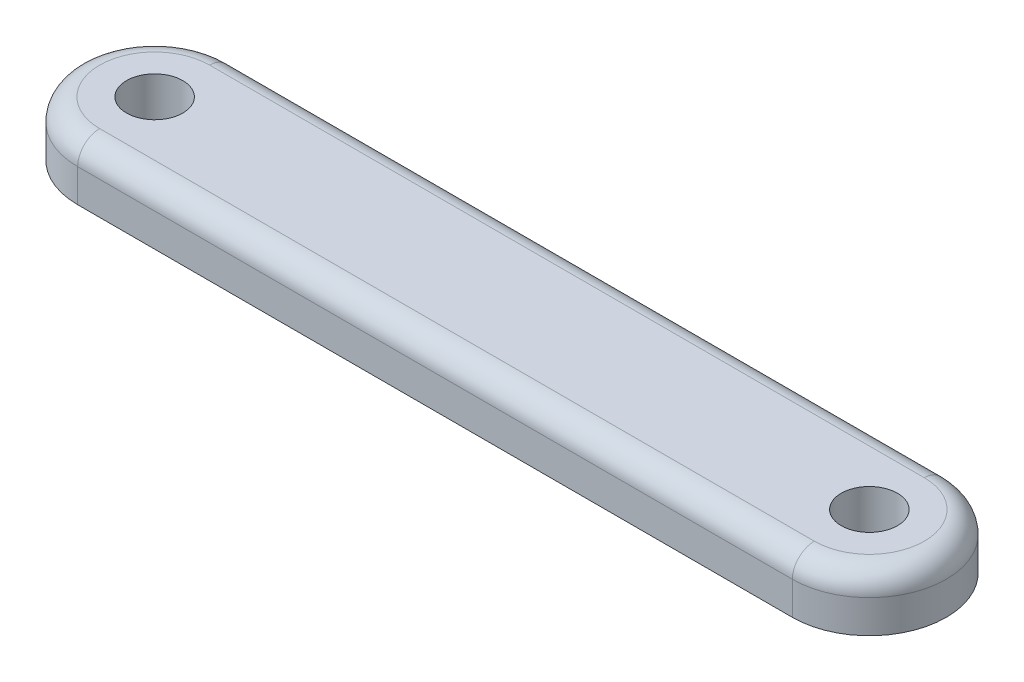
ISO-10303-21;
HEADER;
FILE_DESCRIPTION(('STEP AP214'),'2;1');
FILE_NAME('part.step','',(''),(''),'','','');
FILE_SCHEMA(('AUTOMOTIVE_DESIGN { 1 0 10303 214 1 1 1 1 }'));
ENDSEC;
DATA;
#1=APPLICATION_CONTEXT('core data for automotive mechanical design processes');
#2=APPLICATION_PROTOCOL_DEFINITION('international standard','automotive_design',2000,#1);
#3=PRODUCT_CONTEXT('',#1,'mechanical');
#4=PRODUCT('Part','Part','',(#3));
#5=PRODUCT_RELATED_PRODUCT_CATEGORY('part','',(#4));
#6=PRODUCT_DEFINITION_FORMATION('','',#4);
#7=PRODUCT_DEFINITION_CONTEXT('part definition',#1,'design');
#8=PRODUCT_DEFINITION('design','',#6,#7);
#9=PRODUCT_DEFINITION_SHAPE('','',#8);
#10=(LENGTH_UNIT() NAMED_UNIT(*) SI_UNIT(.MILLI.,.METRE.));
#11=(NAMED_UNIT(*) PLANE_ANGLE_UNIT() SI_UNIT($,.RADIAN.));
#12=(NAMED_UNIT(*) SI_UNIT($,.STERADIAN.) SOLID_ANGLE_UNIT());
#13=UNCERTAINTY_MEASURE_WITH_UNIT(LENGTH_MEASURE(1.E-05),#10,'distance_accuracy_value','');
#14=(GEOMETRIC_REPRESENTATION_CONTEXT(3) GLOBAL_UNCERTAINTY_ASSIGNED_CONTEXT((#13)) GLOBAL_UNIT_ASSIGNED_CONTEXT((#10,
#11,#12)) REPRESENTATION_CONTEXT('',''));
#15=CARTESIAN_POINT('',(0.,0.,0.));
#16=DIRECTION('',(0.,0.,1.));
#17=DIRECTION('',(1.,0.,0.));
#18=AXIS2_PLACEMENT_3D('',#15,#16,#17);
#19=CARTESIAN_POINT('',(33.02,2.54,0.));
#20=DIRECTION('',(0.,-1.,0.));
#21=DIRECTION('',(0.,0.,-1.));
#22=AXIS2_PLACEMENT_3D('',#19,#20,#21);
#23=CYLINDRICAL_SURFACE('',#22,3.556);
#24=DIRECTION('',(0.,-1.,0.));
#25=VECTOR('',#24,1.);
#26=CARTESIAN_POINT('',(33.02,2.54,-3.556));
#27=LINE('',#26,#25);
#28=CARTESIAN_POINT('',(33.02,1.524,-3.556));
#29=VERTEX_POINT('',#28);
#30=CARTESIAN_POINT('',(33.02,0.,-3.556));
#31=VERTEX_POINT('',#30);
#32=EDGE_CURVE('E99',#29,#31,#27,.T.);
#33=ORIENTED_EDGE('',*,*,#32,.F.);
#34=CARTESIAN_POINT('',(33.02,1.524,0.));
#35=DIRECTION('',(0.,1.,0.));
#36=DIRECTION('',(0.,0.,1.));
#37=AXIS2_PLACEMENT_3D('',#34,#35,#36);
#38=CIRCLE('',#37,3.556);
#39=CARTESIAN_POINT('',(33.02,1.524,3.556));
#40=VERTEX_POINT('',#39);
#41=EDGE_CURVE('E57',#29,#40,#38,.F.);
#42=ORIENTED_EDGE('',*,*,#41,.T.);
#43=DIRECTION('',(0.,-1.,0.));
#44=VECTOR('',#43,1.);
#45=CARTESIAN_POINT('',(33.02,2.54,3.556));
#46=LINE('',#45,#44);
#47=CARTESIAN_POINT('',(33.02,0.,3.556));
#48=VERTEX_POINT('',#47);
#49=EDGE_CURVE('E110',#40,#48,#46,.T.);
#50=ORIENTED_EDGE('',*,*,#49,.T.);
#51=CARTESIAN_POINT('',(33.02,0.,0.));
#52=DIRECTION('',(0.,1.,0.));
#53=DIRECTION('',(0.,0.,1.));
#54=AXIS2_PLACEMENT_3D('',#51,#52,#53);
#55=CIRCLE('',#54,3.556);
#56=EDGE_CURVE('E109',#31,#48,#55,.F.);
#57=ORIENTED_EDGE('',*,*,#56,.F.);
#58=EDGE_LOOP('',(#33,#42,#50,#57));
#59=FACE_BOUND('',#58,.T.);
#60=ADVANCED_FACE('F47',(#59),#23,.T.);
#61=CARTESIAN_POINT('',(0.,2.54,-3.556));
#62=DIRECTION('',(0.,0.,-1.));
#63=DIRECTION('',(-1.,0.,0.));
#64=AXIS2_PLACEMENT_3D('',#61,#62,#63);
#65=PLANE('',#64);
#66=DIRECTION('',(0.,-1.,0.));
#67=VECTOR('',#66,1.);
#68=CARTESIAN_POINT('',(0.,2.54,-3.556));
#69=LINE('',#68,#67);
#70=CARTESIAN_POINT('',(0.,1.524,-3.556));
#71=VERTEX_POINT('',#70);
#72=CARTESIAN_POINT('',(0.,0.,-3.556));
#73=VERTEX_POINT('',#72);
#74=EDGE_CURVE('E106',#71,#73,#69,.T.);
#75=ORIENTED_EDGE('',*,*,#74,.F.);
#76=DIRECTION('',(1.,0.,0.));
#77=VECTOR('',#76,1.);
#78=CARTESIAN_POINT('',(0.,1.524,-3.556));
#79=LINE('',#78,#77);
#80=EDGE_CURVE('E11',#71,#29,#79,.T.);
#81=ORIENTED_EDGE('',*,*,#80,.T.);
#82=ORIENTED_EDGE('',*,*,#32,.T.);
#83=DIRECTION('',(1.,0.,0.));
#84=VECTOR('',#83,1.);
#85=CARTESIAN_POINT('',(0.,0.,-3.556));
#86=LINE('',#85,#84);
#87=EDGE_CURVE('E103',#73,#31,#86,.T.);
#88=ORIENTED_EDGE('',*,*,#87,.F.);
#89=EDGE_LOOP('',(#75,#81,#82,#88));
#90=FACE_BOUND('',#89,.T.);
#91=ADVANCED_FACE('F101',(#90),#65,.T.);
#92=CARTESIAN_POINT('',(0.,2.54,0.));
#93=DIRECTION('',(0.,-1.,0.));
#94=DIRECTION('',(0.,0.,-1.));
#95=AXIS2_PLACEMENT_3D('',#92,#93,#94);
#96=CYLINDRICAL_SURFACE('',#95,3.556);
#97=DIRECTION('',(0.,-1.,0.));
#98=VECTOR('',#97,1.);
#99=CARTESIAN_POINT('',(0.,2.54,3.556));
#100=LINE('',#99,#98);
#101=CARTESIAN_POINT('',(0.,1.524,3.556));
#102=VERTEX_POINT('',#101);
#103=CARTESIAN_POINT('',(0.,0.,3.556));
#104=VERTEX_POINT('',#103);
#105=EDGE_CURVE('E138',#102,#104,#100,.T.);
#106=ORIENTED_EDGE('',*,*,#105,.F.);
#107=CARTESIAN_POINT('',(0.,1.524,0.));
#108=DIRECTION('',(0.,1.,0.));
#109=DIRECTION('',(0.,0.,1.));
#110=AXIS2_PLACEMENT_3D('',#107,#108,#109);
#111=CIRCLE('',#110,3.556);
#112=EDGE_CURVE('E156',#102,#71,#111,.F.);
#113=ORIENTED_EDGE('',*,*,#112,.T.);
#114=ORIENTED_EDGE('',*,*,#74,.T.);
#115=CARTESIAN_POINT('',(0.,0.,0.));
#116=DIRECTION('',(0.,1.,0.));
#117=DIRECTION('',(0.,0.,1.));
#118=AXIS2_PLACEMENT_3D('',#115,#116,#117);
#119=CIRCLE('',#118,3.556);
#120=EDGE_CURVE('E121',#73,#104,#119,.T.);
#121=ORIENTED_EDGE('',*,*,#120,.T.);
#122=EDGE_LOOP('',(#106,#113,#114,#121));
#123=FACE_BOUND('',#122,.T.);
#124=ADVANCED_FACE('F221',(#123),#96,.T.);
#125=CARTESIAN_POINT('',(0.,2.54,3.556));
#126=DIRECTION('',(0.,0.,-1.));
#127=DIRECTION('',(-1.,0.,0.));
#128=AXIS2_PLACEMENT_3D('',#125,#126,#127);
#129=PLANE('',#128);
#130=ORIENTED_EDGE('',*,*,#49,.F.);
#131=DIRECTION('',(1.,0.,0.));
#132=VECTOR('',#131,1.);
#133=CARTESIAN_POINT('',(0.,1.524,3.556));
#134=LINE('',#133,#132);
#135=EDGE_CURVE('E160',#40,#102,#134,.F.);
#136=ORIENTED_EDGE('',*,*,#135,.T.);
#137=ORIENTED_EDGE('',*,*,#105,.T.);
#138=DIRECTION('',(1.,0.,0.));
#139=VECTOR('',#138,1.);
#140=CARTESIAN_POINT('',(0.,0.,3.556));
#141=LINE('',#140,#139);
#142=EDGE_CURVE('E125',#104,#48,#141,.T.);
#143=ORIENTED_EDGE('',*,*,#142,.T.);
#144=EDGE_LOOP('',(#130,#136,#137,#143));
#145=FACE_BOUND('',#144,.T.);
#146=ADVANCED_FACE('F227',(#145),#129,.F.);
#147=CARTESIAN_POINT('',(0.,2.54,0.));
#148=DIRECTION('',(0.,-1.,0.));
#149=DIRECTION('',(0.,0.,-1.));
#150=AXIS2_PLACEMENT_3D('',#147,#148,#149);
#151=CYLINDRICAL_SURFACE('',#150,1.3);
#152=CARTESIAN_POINT('',(0.,2.54,0.));
#153=DIRECTION('',(0.,1.,0.));
#154=DIRECTION('',(0.,0.,1.));
#155=AXIS2_PLACEMENT_3D('',#152,#153,#154);
#156=CIRCLE('',#155,1.3);
#157=CARTESIAN_POINT('',(0.,2.54,1.3));
#158=VERTEX_POINT('',#157);
#159=EDGE_CURVE('E135',#158,#158,#156,.T.);
#160=ORIENTED_EDGE('',*,*,#159,.T.);
#161=EDGE_LOOP('',(#160));
#162=FACE_BOUND('',#161,.T.);
#163=CARTESIAN_POINT('',(0.,0.,0.));
#164=DIRECTION('',(0.,1.,0.));
#165=DIRECTION('',(0.,0.,1.));
#166=AXIS2_PLACEMENT_3D('',#163,#164,#165);
#167=CIRCLE('',#166,1.3);
#168=CARTESIAN_POINT('',(0.,0.,1.3));
#169=VERTEX_POINT('',#168);
#170=EDGE_CURVE('E115',#169,#169,#167,.T.);
#171=ORIENTED_EDGE('',*,*,#170,.F.);
#172=EDGE_LOOP('',(#171));
#173=FACE_BOUND('',#172,.T.);
#174=ADVANCED_FACE('F194',(#162,#173),#151,.F.);
#175=CARTESIAN_POINT('',(33.02,2.54,0.));
#176=DIRECTION('',(0.,-1.,0.));
#177=DIRECTION('',(0.,0.,-1.));
#178=AXIS2_PLACEMENT_3D('',#175,#176,#177);
#179=CYLINDRICAL_SURFACE('',#178,1.3);
#180=CARTESIAN_POINT('',(33.02,2.54,0.));
#181=DIRECTION('',(0.,1.,0.));
#182=DIRECTION('',(0.,0.,1.));
#183=AXIS2_PLACEMENT_3D('',#180,#181,#182);
#184=CIRCLE('',#183,1.3);
#185=CARTESIAN_POINT('',(33.02,2.54,1.3));
#186=VERTEX_POINT('',#185);
#187=EDGE_CURVE('E139',#186,#186,#184,.T.);
#188=ORIENTED_EDGE('',*,*,#187,.T.);
#189=EDGE_LOOP('',(#188));
#190=FACE_BOUND('',#189,.T.);
#191=CARTESIAN_POINT('',(33.02,0.,0.));
#192=DIRECTION('',(0.,1.,0.));
#193=DIRECTION('',(0.,0.,1.));
#194=AXIS2_PLACEMENT_3D('',#191,#192,#193);
#195=CIRCLE('',#194,1.3);
#196=CARTESIAN_POINT('',(33.02,0.,1.3));
#197=VERTEX_POINT('',#196);
#198=EDGE_CURVE('E131',#197,#197,#195,.T.);
#199=ORIENTED_EDGE('',*,*,#198,.F.);
#200=EDGE_LOOP('',(#199));
#201=FACE_BOUND('',#200,.T.);
#202=ADVANCED_FACE('F200',(#190,#201),#179,.F.);
#203=CARTESIAN_POINT('',(0.,2.54,0.));
#204=DIRECTION('',(0.,1.,0.));
#205=DIRECTION('',(0.,0.,1.));
#206=AXIS2_PLACEMENT_3D('',#203,#204,#205);
#207=PLANE('',#206);
#208=DIRECTION('',(1.,0.,0.));
#209=VECTOR('',#208,1.);
#210=CARTESIAN_POINT('',(0.,2.54,-2.54));
#211=LINE('',#210,#209);
#212=CARTESIAN_POINT('',(33.02,2.54,-2.54));
#213=VERTEX_POINT('',#212);
#214=CARTESIAN_POINT('',(0.,2.54,-2.54));
#215=VERTEX_POINT('',#214);
#216=EDGE_CURVE('E105',#213,#215,#211,.F.);
#217=ORIENTED_EDGE('',*,*,#216,.T.);
#218=CARTESIAN_POINT('',(0.,2.54,0.));
#219=DIRECTION('',(0.,1.,0.));
#220=DIRECTION('',(0.,0.,1.));
#221=AXIS2_PLACEMENT_3D('',#218,#219,#220);
#222=CIRCLE('',#221,2.54);
#223=CARTESIAN_POINT('',(0.,2.54,2.54));
#224=VERTEX_POINT('',#223);
#225=EDGE_CURVE('E152',#215,#224,#222,.T.);
#226=ORIENTED_EDGE('',*,*,#225,.T.);
#227=DIRECTION('',(1.,0.,0.));
#228=VECTOR('',#227,1.);
#229=CARTESIAN_POINT('',(33.02,2.54,2.54));
#230=LINE('',#229,#228);
#231=CARTESIAN_POINT('',(33.02,2.54,2.54));
#232=VERTEX_POINT('',#231);
#233=EDGE_CURVE('E149',#224,#232,#230,.T.);
#234=ORIENTED_EDGE('',*,*,#233,.T.);
#235=CARTESIAN_POINT('',(33.02,2.54,0.));
#236=DIRECTION('',(0.,1.,0.));
#237=DIRECTION('',(0.,0.,1.));
#238=AXIS2_PLACEMENT_3D('',#235,#236,#237);
#239=CIRCLE('',#238,2.54);
#240=EDGE_CURVE('E146',#232,#213,#239,.T.);
#241=ORIENTED_EDGE('',*,*,#240,.T.);
#242=EDGE_LOOP('',(#217,#226,#234,#241));
#243=FACE_BOUND('',#242,.T.);
#244=ORIENTED_EDGE('',*,*,#159,.F.);
#245=EDGE_LOOP('',(#244));
#246=FACE_BOUND('',#245,.T.);
#247=ORIENTED_EDGE('',*,*,#187,.F.);
#248=EDGE_LOOP('',(#247));
#249=FACE_BOUND('',#248,.T.);
#250=ADVANCED_FACE('F197',(#243,#246,#249),#207,.T.);
#251=CARTESIAN_POINT('',(0.,0.,0.));
#252=DIRECTION('',(0.,1.,0.));
#253=DIRECTION('',(0.,0.,1.));
#254=AXIS2_PLACEMENT_3D('',#251,#252,#253);
#255=PLANE('',#254);
#256=ORIENTED_EDGE('',*,*,#170,.T.);
#257=EDGE_LOOP('',(#256));
#258=FACE_BOUND('',#257,.T.);
#259=ORIENTED_EDGE('',*,*,#56,.T.);
#260=ORIENTED_EDGE('',*,*,#142,.F.);
#261=ORIENTED_EDGE('',*,*,#120,.F.);
#262=ORIENTED_EDGE('',*,*,#87,.T.);
#263=EDGE_LOOP('',(#259,#260,#261,#262));
#264=FACE_BOUND('',#263,.T.);
#265=ORIENTED_EDGE('',*,*,#198,.T.);
#266=EDGE_LOOP('',(#265));
#267=FACE_BOUND('',#266,.T.);
#268=ADVANCED_FACE('F118',(#258,#264,#267),#255,.F.);
#269=CARTESIAN_POINT('',(33.02,1.524,0.));
#270=DIRECTION('',(0.,1.,0.));
#271=DIRECTION('',(0.,0.,1.));
#272=AXIS2_PLACEMENT_3D('',#269,#270,#271);
#273=TOROIDAL_SURFACE('',#272,2.54,1.016);
#274=CARTESIAN_POINT('',(33.02,1.524,2.54));
#275=DIRECTION('',(-1.,0.,0.));
#276=DIRECTION('',(0.,0.,1.));
#277=AXIS2_PLACEMENT_3D('',#274,#275,#276);
#278=CIRCLE('',#277,1.016);
#279=EDGE_CURVE('E170',#40,#232,#278,.T.);
#280=ORIENTED_EDGE('',*,*,#279,.F.);
#281=ORIENTED_EDGE('',*,*,#41,.F.);
#282=CARTESIAN_POINT('',(33.02,1.524,-2.54));
#283=DIRECTION('',(-1.,0.,0.));
#284=DIRECTION('',(0.,0.,1.));
#285=AXIS2_PLACEMENT_3D('',#282,#283,#284);
#286=CIRCLE('',#285,1.016);
#287=EDGE_CURVE('E51',#213,#29,#286,.T.);
#288=ORIENTED_EDGE('',*,*,#287,.F.);
#289=ORIENTED_EDGE('',*,*,#240,.F.);
#290=EDGE_LOOP('',(#280,#281,#288,#289));
#291=FACE_BOUND('',#290,.T.);
#292=ADVANCED_FACE('F49',(#291),#273,.T.);
#293=CARTESIAN_POINT('',(0.,1.524,-2.54));
#294=DIRECTION('',(1.,0.,0.));
#295=DIRECTION('',(0.,0.,-1.));
#296=AXIS2_PLACEMENT_3D('',#293,#294,#295);
#297=CYLINDRICAL_SURFACE('',#296,1.016);
#298=ORIENTED_EDGE('',*,*,#287,.T.);
#299=ORIENTED_EDGE('',*,*,#80,.F.);
#300=CARTESIAN_POINT('',(0.,1.524,-2.54));
#301=DIRECTION('',(-1.,0.,0.));
#302=DIRECTION('',(0.,0.,1.));
#303=AXIS2_PLACEMENT_3D('',#300,#301,#302);
#304=CIRCLE('',#303,1.016);
#305=EDGE_CURVE('E168',#215,#71,#304,.T.);
#306=ORIENTED_EDGE('',*,*,#305,.F.);
#307=ORIENTED_EDGE('',*,*,#216,.F.);
#308=EDGE_LOOP('',(#298,#299,#306,#307));
#309=FACE_BOUND('',#308,.T.);
#310=ADVANCED_FACE('F215',(#309),#297,.T.);
#311=CARTESIAN_POINT('',(0.,1.524,2.54));
#312=DIRECTION('',(-1.,0.,0.));
#313=DIRECTION('',(0.,0.,1.));
#314=AXIS2_PLACEMENT_3D('',#311,#312,#313);
#315=CYLINDRICAL_SURFACE('',#314,1.016);
#316=ORIENTED_EDGE('',*,*,#279,.T.);
#317=ORIENTED_EDGE('',*,*,#233,.F.);
#318=CARTESIAN_POINT('',(0.,1.524,2.54));
#319=DIRECTION('',(-1.,0.,0.));
#320=DIRECTION('',(0.,0.,1.));
#321=AXIS2_PLACEMENT_3D('',#318,#319,#320);
#322=CIRCLE('',#321,1.016);
#323=EDGE_CURVE('E165',#102,#224,#322,.T.);
#324=ORIENTED_EDGE('',*,*,#323,.F.);
#325=ORIENTED_EDGE('',*,*,#135,.F.);
#326=EDGE_LOOP('',(#316,#317,#324,#325));
#327=FACE_BOUND('',#326,.T.);
#328=ADVANCED_FACE('F231',(#327),#315,.T.);
#329=CARTESIAN_POINT('',(0.,1.524,0.));
#330=DIRECTION('',(0.,1.,0.));
#331=DIRECTION('',(0.,0.,1.));
#332=AXIS2_PLACEMENT_3D('',#329,#330,#331);
#333=TOROIDAL_SURFACE('',#332,2.54,1.016);
#334=ORIENTED_EDGE('',*,*,#305,.T.);
#335=ORIENTED_EDGE('',*,*,#112,.F.);
#336=ORIENTED_EDGE('',*,*,#323,.T.);
#337=ORIENTED_EDGE('',*,*,#225,.F.);
#338=EDGE_LOOP('',(#334,#335,#336,#337));
#339=FACE_BOUND('',#338,.T.);
#340=ADVANCED_FACE('F228',(#339),#333,.T.);
#341=CLOSED_SHELL('',(#60,#91,#124,#146,#174,#202,#250,#268,#292,#310,#328,#340));
#342=MANIFOLD_SOLID_BREP('B2',#341);
#343=ADVANCED_BREP_SHAPE_REPRESENTATION('',(#18,#342),#14);
#344=SHAPE_DEFINITION_REPRESENTATION(#9,#343);
ENDSEC;
END-ISO-10303-21;
